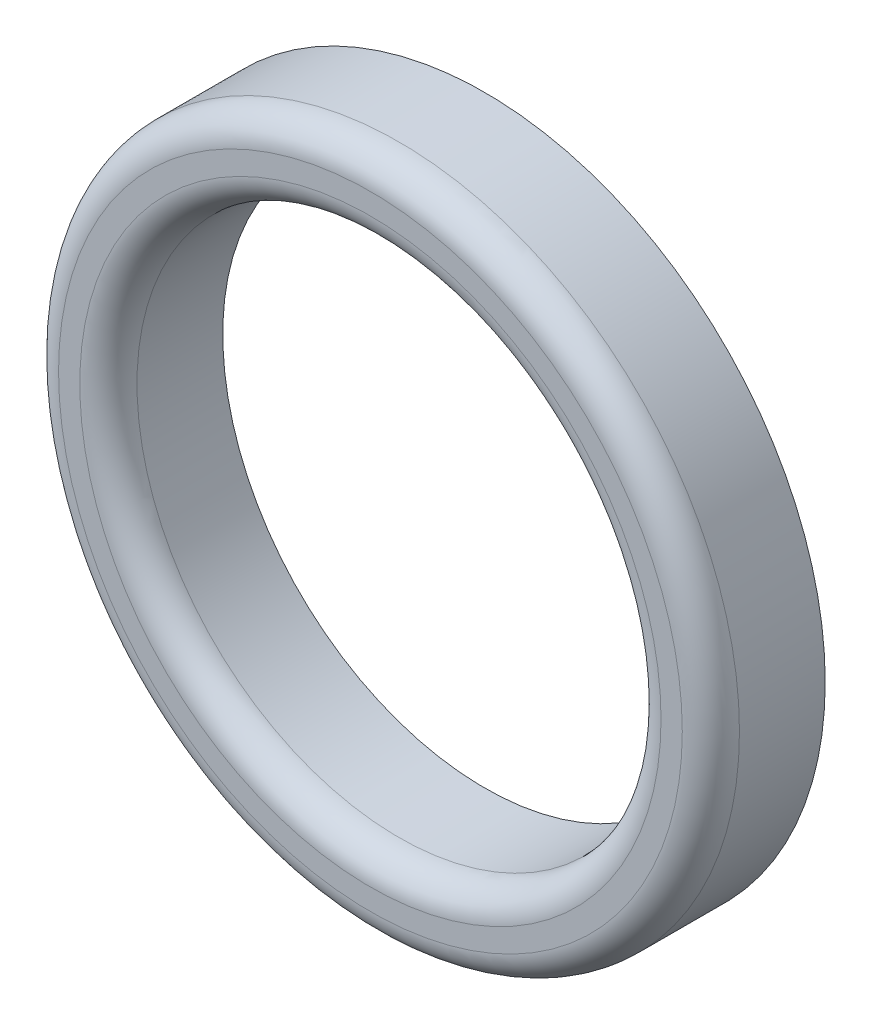
ISO-10303-21;
HEADER;
FILE_DESCRIPTION(('STEP AP214'),'2;1');
FILE_NAME('part.step','',(''),(''),'','','');
FILE_SCHEMA(('AUTOMOTIVE_DESIGN { 1 0 10303 214 1 1 1 1 }'));
ENDSEC;
DATA;
#1=APPLICATION_CONTEXT('core data for automotive mechanical design processes');
#2=APPLICATION_PROTOCOL_DEFINITION('international standard','automotive_design',2000,#1);
#3=PRODUCT_CONTEXT('',#1,'mechanical');
#4=PRODUCT('Part','Part','',(#3));
#5=PRODUCT_RELATED_PRODUCT_CATEGORY('part','',(#4));
#6=PRODUCT_DEFINITION_FORMATION('','',#4);
#7=PRODUCT_DEFINITION_CONTEXT('part definition',#1,'design');
#8=PRODUCT_DEFINITION('design','',#6,#7);
#9=PRODUCT_DEFINITION_SHAPE('','',#8);
#10=(LENGTH_UNIT() NAMED_UNIT(*) SI_UNIT(.MILLI.,.METRE.));
#11=(NAMED_UNIT(*) PLANE_ANGLE_UNIT() SI_UNIT($,.RADIAN.));
#12=(NAMED_UNIT(*) SI_UNIT($,.STERADIAN.) SOLID_ANGLE_UNIT());
#13=UNCERTAINTY_MEASURE_WITH_UNIT(LENGTH_MEASURE(1.E-05),#10,'distance_accuracy_value','');
#14=(GEOMETRIC_REPRESENTATION_CONTEXT(3) GLOBAL_UNCERTAINTY_ASSIGNED_CONTEXT((#13)) GLOBAL_UNIT_ASSIGNED_CONTEXT((#10,
#11,#12)) REPRESENTATION_CONTEXT('',''));
#15=CARTESIAN_POINT('',(0.,0.,0.));
#16=DIRECTION('',(0.,0.,1.));
#17=DIRECTION('',(1.,0.,0.));
#18=AXIS2_PLACEMENT_3D('',#15,#16,#17);
#19=CARTESIAN_POINT('',(0.,0.,0.));
#20=DIRECTION('',(0.,0.,1.));
#21=DIRECTION('',(1.,0.,0.));
#22=AXIS2_PLACEMENT_3D('',#19,#20,#21);
#23=PLANE('',#22);
#24=CARTESIAN_POINT('',(0.,0.,0.));
#25=DIRECTION('',(0.,0.,1.));
#26=DIRECTION('',(1.,0.,0.));
#27=AXIS2_PLACEMENT_3D('',#24,#25,#26);
#28=CIRCLE('',#27,27.5);
#29=CARTESIAN_POINT('',(27.5,0.,0.));
#30=VERTEX_POINT('',#29);
#31=EDGE_CURVE('E58',#30,#30,#28,.T.);
#32=ORIENTED_EDGE('',*,*,#31,.T.);
#33=EDGE_LOOP('',(#32));
#34=FACE_BOUND('',#33,.T.);
#35=CARTESIAN_POINT('',(0.,0.,0.));
#36=DIRECTION('',(0.,0.,1.));
#37=DIRECTION('',(1.,0.,0.));
#38=AXIS2_PLACEMENT_3D('',#35,#36,#37);
#39=CIRCLE('',#38,28.5);
#40=CARTESIAN_POINT('',(28.5,0.,0.));
#41=VERTEX_POINT('',#40);
#42=EDGE_CURVE('E63',#41,#41,#39,.T.);
#43=ORIENTED_EDGE('',*,*,#42,.F.);
#44=EDGE_LOOP('',(#43));
#45=FACE_BOUND('',#44,.T.);
#46=ADVANCED_FACE('F40',(#34,#45),#23,.F.);
#47=CARTESIAN_POINT('',(0.,0.,12.));
#48=DIRECTION('',(0.,0.,1.));
#49=DIRECTION('',(1.,0.,0.));
#50=AXIS2_PLACEMENT_3D('',#47,#48,#49);
#51=PLANE('',#50);
#52=CARTESIAN_POINT('',(0.,0.,12.));
#53=DIRECTION('',(0.,0.,1.));
#54=DIRECTION('',(1.,0.,0.));
#55=AXIS2_PLACEMENT_3D('',#52,#53,#54);
#56=CIRCLE('',#55,32.73);
#57=CARTESIAN_POINT('',(32.73,0.,12.));
#58=VERTEX_POINT('',#57);
#59=EDGE_CURVE('E48',#58,#58,#56,.T.);
#60=ORIENTED_EDGE('',*,*,#59,.T.);
#61=EDGE_LOOP('',(#60));
#62=FACE_BOUND('',#61,.T.);
#63=CARTESIAN_POINT('',(0.,0.,12.));
#64=DIRECTION('',(0.,0.,1.));
#65=DIRECTION('',(1.,0.,0.));
#66=AXIS2_PLACEMENT_3D('',#63,#64,#65);
#67=CIRCLE('',#66,30.5);
#68=CARTESIAN_POINT('',(30.5,0.,12.));
#69=VERTEX_POINT('',#68);
#70=EDGE_CURVE('E55',#69,#69,#67,.F.);
#71=ORIENTED_EDGE('',*,*,#70,.T.);
#72=EDGE_LOOP('',(#71));
#73=FACE_BOUND('',#72,.T.);
#74=ADVANCED_FACE('F102',(#62,#73),#51,.T.);
#75=CARTESIAN_POINT('',(0.,0.,0.));
#76=DIRECTION('',(0.,0.,1.));
#77=DIRECTION('',(1.,0.,0.));
#78=AXIS2_PLACEMENT_3D('',#75,#76,#77);
#79=CIRCLE('',#78,34.73);
#80=CARTESIAN_POINT('',(34.73,0.,0.));
#81=VERTEX_POINT('',#80);
#82=EDGE_CURVE('E66',#81,#81,#79,.T.);
#83=ORIENTED_EDGE('',*,*,#82,.T.);
#84=EDGE_LOOP('',(#83));
#85=FACE_BOUND('',#84,.T.);
#86=CARTESIAN_POINT('',(0.,0.,0.));
#87=DIRECTION('',(0.,0.,1.));
#88=DIRECTION('',(1.,0.,0.));
#89=AXIS2_PLACEMENT_3D('',#86,#87,#88);
#90=CIRCLE('',#89,35.73);
#91=CARTESIAN_POINT('',(35.73,0.,0.));
#92=VERTEX_POINT('',#91);
#93=EDGE_CURVE('E60',#92,#92,#90,.T.);
#94=ORIENTED_EDGE('',*,*,#93,.F.);
#95=EDGE_LOOP('',(#94));
#96=FACE_BOUND('',#95,.T.);
#97=ADVANCED_FACE('F110',(#85,#96),#23,.F.);
#98=CARTESIAN_POINT('',(0.,0.,12.));
#99=DIRECTION('',(0.,0.,-1.));
#100=DIRECTION('',(-1.,0.,0.));
#101=AXIS2_PLACEMENT_3D('',#98,#99,#100);
#102=CYLINDRICAL_SURFACE('',#101,35.73);
#103=CARTESIAN_POINT('',(0.,0.,9.));
#104=DIRECTION('',(0.,0.,1.));
#105=DIRECTION('',(1.,0.,0.));
#106=AXIS2_PLACEMENT_3D('',#103,#104,#105);
#107=CIRCLE('',#106,35.73);
#108=CARTESIAN_POINT('',(35.73,0.,9.));
#109=VERTEX_POINT('',#108);
#110=EDGE_CURVE('E42',#109,#109,#107,.F.);
#111=ORIENTED_EDGE('',*,*,#110,.T.);
#112=EDGE_LOOP('',(#111));
#113=FACE_BOUND('',#112,.T.);
#114=ORIENTED_EDGE('',*,*,#93,.T.);
#115=EDGE_LOOP('',(#114));
#116=FACE_BOUND('',#115,.T.);
#117=ADVANCED_FACE('F119',(#113,#116),#102,.T.);
#118=CARTESIAN_POINT('',(0.,0.,12.));
#119=DIRECTION('',(0.,0.,-1.));
#120=DIRECTION('',(-1.,0.,0.));
#121=AXIS2_PLACEMENT_3D('',#118,#119,#120);
#122=CYLINDRICAL_SURFACE('',#121,27.5);
#123=CARTESIAN_POINT('',(0.,0.,9.));
#124=DIRECTION('',(0.,0.,1.));
#125=DIRECTION('',(1.,0.,0.));
#126=AXIS2_PLACEMENT_3D('',#123,#124,#125);
#127=CIRCLE('',#126,27.5);
#128=CARTESIAN_POINT('',(27.5,0.,9.));
#129=VERTEX_POINT('',#128);
#130=EDGE_CURVE('E10',#129,#129,#127,.T.);
#131=ORIENTED_EDGE('',*,*,#130,.T.);
#132=EDGE_LOOP('',(#131));
#133=FACE_BOUND('',#132,.T.);
#134=ORIENTED_EDGE('',*,*,#31,.F.);
#135=EDGE_LOOP('',(#134));
#136=FACE_BOUND('',#135,.T.);
#137=ADVANCED_FACE('F124',(#133,#136),#122,.F.);
#138=CARTESIAN_POINT('',(0.,0.,9.));
#139=DIRECTION('',(0.,0.,1.));
#140=DIRECTION('',(1.,0.,0.));
#141=AXIS2_PLACEMENT_3D('',#138,#139,#140);
#142=TOROIDAL_SURFACE('',#141,32.73,3.);
#143=ORIENTED_EDGE('',*,*,#110,.F.);
#144=EDGE_LOOP('',(#143));
#145=FACE_BOUND('',#144,.T.);
#146=ORIENTED_EDGE('',*,*,#59,.F.);
#147=EDGE_LOOP('',(#146));
#148=FACE_BOUND('',#147,.T.);
#149=ADVANCED_FACE('F140',(#145,#148),#142,.T.);
#150=CARTESIAN_POINT('',(0.,0.,9.));
#151=DIRECTION('',(0.,0.,1.));
#152=DIRECTION('',(1.,0.,0.));
#153=AXIS2_PLACEMENT_3D('',#150,#151,#152);
#154=TOROIDAL_SURFACE('',#153,30.5,3.);
#155=ORIENTED_EDGE('',*,*,#70,.F.);
#156=EDGE_LOOP('',(#155));
#157=FACE_BOUND('',#156,.T.);
#158=ORIENTED_EDGE('',*,*,#130,.F.);
#159=EDGE_LOOP('',(#158));
#160=FACE_BOUND('',#159,.T.);
#161=ADVANCED_FACE('F39',(#157,#160),#154,.T.);
#162=CARTESIAN_POINT('',(0.,0.,11.));
#163=DIRECTION('',(0.,0.,1.));
#164=DIRECTION('',(1.,0.,0.));
#165=AXIS2_PLACEMENT_3D('',#162,#163,#164);
#166=PLANE('',#165);
#167=CARTESIAN_POINT('',(0.,0.,11.));
#168=DIRECTION('',(0.,0.,1.));
#169=DIRECTION('',(1.,0.,0.));
#170=AXIS2_PLACEMENT_3D('',#167,#168,#169);
#171=CIRCLE('',#170,32.73);
#172=CARTESIAN_POINT('',(32.73,0.,11.));
#173=VERTEX_POINT('',#172);
#174=EDGE_CURVE('E79',#173,#173,#171,.T.);
#175=ORIENTED_EDGE('',*,*,#174,.F.);
#176=EDGE_LOOP('',(#175));
#177=FACE_BOUND('',#176,.T.);
#178=CARTESIAN_POINT('',(0.,0.,11.));
#179=DIRECTION('',(0.,0.,1.));
#180=DIRECTION('',(1.,0.,0.));
#181=AXIS2_PLACEMENT_3D('',#178,#179,#180);
#182=CIRCLE('',#181,30.5);
#183=CARTESIAN_POINT('',(30.5,0.,11.));
#184=VERTEX_POINT('',#183);
#185=EDGE_CURVE('E67',#184,#184,#182,.F.);
#186=ORIENTED_EDGE('',*,*,#185,.F.);
#187=EDGE_LOOP('',(#186));
#188=FACE_BOUND('',#187,.T.);
#189=ADVANCED_FACE('F83',(#177,#188),#166,.F.);
#190=CARTESIAN_POINT('',(0.,0.,12.));
#191=DIRECTION('',(0.,0.,-1.));
#192=DIRECTION('',(-1.,0.,0.));
#193=AXIS2_PLACEMENT_3D('',#190,#191,#192);
#194=CYLINDRICAL_SURFACE('',#193,34.73);
#195=CARTESIAN_POINT('',(0.,0.,9.));
#196=DIRECTION('',(0.,0.,-1.));
#197=DIRECTION('',(-1.,0.,0.));
#198=AXIS2_PLACEMENT_3D('',#195,#196,#197);
#199=CIRCLE('',#198,34.73);
#200=CARTESIAN_POINT('',(-34.73,0.,9.));
#201=VERTEX_POINT('',#200);
#202=EDGE_CURVE('E71',#201,#201,#199,.T.);
#203=ORIENTED_EDGE('',*,*,#202,.F.);
#204=EDGE_LOOP('',(#203));
#205=FACE_BOUND('',#204,.T.);
#206=ORIENTED_EDGE('',*,*,#82,.F.);
#207=EDGE_LOOP('',(#206));
#208=FACE_BOUND('',#207,.T.);
#209=ADVANCED_FACE('F87',(#205,#208),#194,.F.);
#210=CARTESIAN_POINT('',(0.,0.,12.));
#211=DIRECTION('',(0.,0.,-1.));
#212=DIRECTION('',(-1.,0.,0.));
#213=AXIS2_PLACEMENT_3D('',#210,#211,#212);
#214=CYLINDRICAL_SURFACE('',#213,28.5);
#215=CARTESIAN_POINT('',(0.,0.,9.));
#216=DIRECTION('',(0.,0.,-1.));
#217=DIRECTION('',(-1.,0.,0.));
#218=AXIS2_PLACEMENT_3D('',#215,#216,#217);
#219=CIRCLE('',#218,28.5);
#220=CARTESIAN_POINT('',(-28.5,0.,9.));
#221=VERTEX_POINT('',#220);
#222=EDGE_CURVE('E65',#221,#221,#219,.F.);
#223=ORIENTED_EDGE('',*,*,#222,.F.);
#224=EDGE_LOOP('',(#223));
#225=FACE_BOUND('',#224,.T.);
#226=ORIENTED_EDGE('',*,*,#42,.T.);
#227=EDGE_LOOP('',(#226));
#228=FACE_BOUND('',#227,.T.);
#229=ADVANCED_FACE('F100',(#225,#228),#214,.T.);
#230=CARTESIAN_POINT('',(0.,0.,9.));
#231=DIRECTION('',(0.,0.,1.));
#232=DIRECTION('',(1.,0.,0.));
#233=AXIS2_PLACEMENT_3D('',#230,#231,#232);
#234=TOROIDAL_SURFACE('',#233,32.73,2.);
#235=ORIENTED_EDGE('',*,*,#202,.T.);
#236=EDGE_LOOP('',(#235));
#237=FACE_BOUND('',#236,.T.);
#238=ORIENTED_EDGE('',*,*,#174,.T.);
#239=EDGE_LOOP('',(#238));
#240=FACE_BOUND('',#239,.T.);
#241=ADVANCED_FACE('F81',(#237,#240),#234,.F.);
#242=CARTESIAN_POINT('',(0.,0.,9.));
#243=DIRECTION('',(0.,0.,1.));
#244=DIRECTION('',(1.,0.,0.));
#245=AXIS2_PLACEMENT_3D('',#242,#243,#244);
#246=TOROIDAL_SURFACE('',#245,30.5,2.);
#247=ORIENTED_EDGE('',*,*,#185,.T.);
#248=EDGE_LOOP('',(#247));
#249=FACE_BOUND('',#248,.T.);
#250=ORIENTED_EDGE('',*,*,#222,.T.);
#251=EDGE_LOOP('',(#250));
#252=FACE_BOUND('',#251,.T.);
#253=ADVANCED_FACE('F93',(#249,#252),#246,.F.);
#254=CLOSED_SHELL('',(#46,#74,#97,#117,#137,#149,#161,#189,#209,#229,#241,#253));
#255=MANIFOLD_SOLID_BREP('B2',#254);
#256=ADVANCED_BREP_SHAPE_REPRESENTATION('',(#18,#255),#14);
#257=SHAPE_DEFINITION_REPRESENTATION(#9,#256);
ENDSEC;
END-ISO-10303-21;
